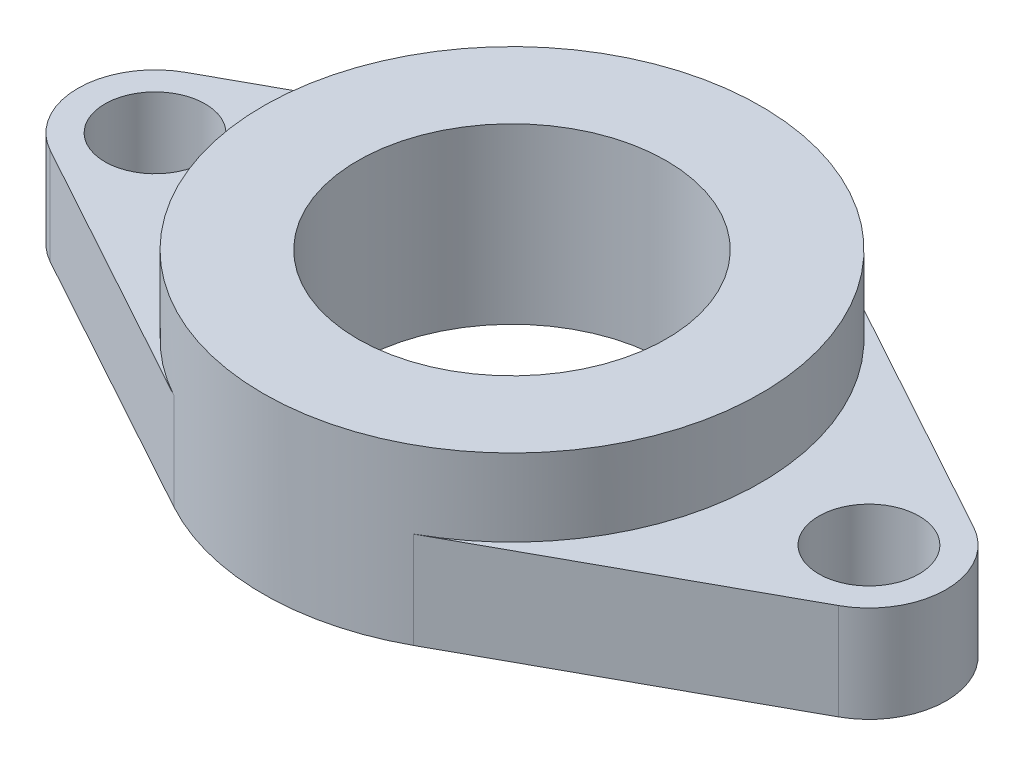
ISO-10303-21;
HEADER;
FILE_DESCRIPTION(('STEP AP214'),'2;1');
FILE_NAME('part.step','',(''),(''),'','','');
FILE_SCHEMA(('AUTOMOTIVE_DESIGN { 1 0 10303 214 1 1 1 1 }'));
ENDSEC;
DATA;
#1=APPLICATION_CONTEXT('core data for automotive mechanical design processes');
#2=APPLICATION_PROTOCOL_DEFINITION('international standard','automotive_design',2000,#1);
#3=PRODUCT_CONTEXT('',#1,'mechanical');
#4=PRODUCT('Part','Part','',(#3));
#5=PRODUCT_RELATED_PRODUCT_CATEGORY('part','',(#4));
#6=PRODUCT_DEFINITION_FORMATION('','',#4);
#7=PRODUCT_DEFINITION_CONTEXT('part definition',#1,'design');
#8=PRODUCT_DEFINITION('design','',#6,#7);
#9=PRODUCT_DEFINITION_SHAPE('','',#8);
#10=(LENGTH_UNIT() NAMED_UNIT(*) SI_UNIT(.MILLI.,.METRE.));
#11=(NAMED_UNIT(*) PLANE_ANGLE_UNIT() SI_UNIT($,.RADIAN.));
#12=(NAMED_UNIT(*) SI_UNIT($,.STERADIAN.) SOLID_ANGLE_UNIT());
#13=UNCERTAINTY_MEASURE_WITH_UNIT(LENGTH_MEASURE(1.E-05),#10,'distance_accuracy_value','');
#14=(GEOMETRIC_REPRESENTATION_CONTEXT(3) GLOBAL_UNCERTAINTY_ASSIGNED_CONTEXT((#13)) GLOBAL_UNIT_ASSIGNED_CONTEXT((#10,
#11,#12)) REPRESENTATION_CONTEXT('',''));
#15=CARTESIAN_POINT('',(0.,0.,0.));
#16=DIRECTION('',(0.,0.,1.));
#17=DIRECTION('',(1.,0.,0.));
#18=AXIS2_PLACEMENT_3D('',#15,#16,#17);
#19=CARTESIAN_POINT('',(0.,9.,0.));
#20=DIRECTION('',(0.,-1.,0.));
#21=DIRECTION('',(0.,0.,-1.));
#22=AXIS2_PLACEMENT_3D('',#19,#20,#21);
#23=CYLINDRICAL_SURFACE('',#22,12.9);
#24=CARTESIAN_POINT('',(0.,5.,0.));
#25=DIRECTION('',(0.,1.,0.));
#26=DIRECTION('',(0.,0.,1.));
#27=AXIS2_PLACEMENT_3D('',#24,#25,#26);
#28=CIRCLE('',#27,12.9);
#29=CARTESIAN_POINT('',(-6.20594594594594,5.,-11.3091217570595));
#30=VERTEX_POINT('',#29);
#31=CARTESIAN_POINT('',(-6.20594594594594,5.,11.3091217570595));
#32=VERTEX_POINT('',#31);
#33=EDGE_CURVE('E44',#30,#32,#28,.T.);
#34=ORIENTED_EDGE('',*,*,#33,.T.);
#35=DIRECTION('',(0.,-1.,0.));
#36=VECTOR('',#35,1.);
#37=CARTESIAN_POINT('',(-6.20594594594594,5.,11.3091217570595));
#38=LINE('',#37,#36);
#39=CARTESIAN_POINT('',(-6.20594594594594,0.,11.3091217570595));
#40=VERTEX_POINT('',#39);
#41=EDGE_CURVE('E108',#32,#40,#38,.T.);
#42=ORIENTED_EDGE('',*,*,#41,.T.);
#43=CARTESIAN_POINT('',(0.,0.,0.));
#44=DIRECTION('',(0.,1.,0.));
#45=DIRECTION('',(0.,0.,1.));
#46=AXIS2_PLACEMENT_3D('',#43,#44,#45);
#47=CIRCLE('',#46,12.9);
#48=CARTESIAN_POINT('',(6.20594594594594,0.,11.3091217570595));
#49=VERTEX_POINT('',#48);
#50=EDGE_CURVE('E125',#40,#49,#47,.T.);
#51=ORIENTED_EDGE('',*,*,#50,.T.);
#52=DIRECTION('',(0.,-1.,0.));
#53=VECTOR('',#52,1.);
#54=CARTESIAN_POINT('',(6.20594594594594,5.,11.3091217570595));
#55=LINE('',#54,#53);
#56=CARTESIAN_POINT('',(6.20594594594594,5.,11.3091217570595));
#57=VERTEX_POINT('',#56);
#58=EDGE_CURVE('E129',#57,#49,#55,.T.);
#59=ORIENTED_EDGE('',*,*,#58,.F.);
#60=CARTESIAN_POINT('',(6.20594594594595,5.,-11.3091217570595));
#61=VERTEX_POINT('',#60);
#62=EDGE_CURVE('E11',#57,#61,#28,.T.);
#63=ORIENTED_EDGE('',*,*,#62,.T.);
#64=DIRECTION('',(0.,-1.,0.));
#65=VECTOR('',#64,1.);
#66=CARTESIAN_POINT('',(6.20594594594594,5.,-11.3091217570595));
#67=LINE('',#66,#65);
#68=CARTESIAN_POINT('',(6.20594594594594,0.,-11.3091217570595));
#69=VERTEX_POINT('',#68);
#70=EDGE_CURVE('E139',#61,#69,#67,.T.);
#71=ORIENTED_EDGE('',*,*,#70,.T.);
#72=CARTESIAN_POINT('',(-6.20594594594595,0.,-11.3091217570595));
#73=VERTEX_POINT('',#72);
#74=EDGE_CURVE('E127',#69,#73,#47,.T.);
#75=ORIENTED_EDGE('',*,*,#74,.T.);
#76=DIRECTION('',(0.,-1.,0.));
#77=VECTOR('',#76,1.);
#78=CARTESIAN_POINT('',(-6.20594594594594,5.,-11.3091217570595));
#79=LINE('',#78,#77);
#80=EDGE_CURVE('E56',#30,#73,#79,.T.);
#81=ORIENTED_EDGE('',*,*,#80,.F.);
#82=EDGE_LOOP('',(#34,#42,#51,#59,#63,#71,#75,#81));
#83=FACE_BOUND('',#82,.T.);
#84=CARTESIAN_POINT('',(0.,9.,0.));
#85=DIRECTION('',(0.,1.,0.));
#86=DIRECTION('',(0.,0.,1.));
#87=AXIS2_PLACEMENT_3D('',#84,#85,#86);
#88=CIRCLE('',#87,12.9);
#89=CARTESIAN_POINT('',(0.,9.,12.9));
#90=VERTEX_POINT('',#89);
#91=EDGE_CURVE('E133',#90,#90,#88,.T.);
#92=ORIENTED_EDGE('',*,*,#91,.F.);
#93=EDGE_LOOP('',(#92));
#94=FACE_BOUND('',#93,.T.);
#95=ADVANCED_FACE('F36',(#83,#94),#23,.T.);
#96=CARTESIAN_POINT('',(0.,9.,0.));
#97=DIRECTION('',(0.,1.,0.));
#98=DIRECTION('',(0.,0.,1.));
#99=AXIS2_PLACEMENT_3D('',#96,#97,#98);
#100=PLANE('',#99);
#101=CARTESIAN_POINT('',(0.,9.,0.));
#102=DIRECTION('',(0.,1.,0.));
#103=DIRECTION('',(0.,0.,1.));
#104=AXIS2_PLACEMENT_3D('',#101,#102,#103);
#105=CIRCLE('',#104,8.);
#106=CARTESIAN_POINT('',(0.,9.,8.));
#107=VERTEX_POINT('',#106);
#108=EDGE_CURVE('E186',#107,#107,#105,.F.);
#109=ORIENTED_EDGE('',*,*,#108,.T.);
#110=EDGE_LOOP('',(#109));
#111=FACE_BOUND('',#110,.T.);
#112=ORIENTED_EDGE('',*,*,#91,.T.);
#113=EDGE_LOOP('',(#112));
#114=FACE_BOUND('',#113,.T.);
#115=ADVANCED_FACE('F204',(#111,#114),#100,.T.);
#116=CARTESIAN_POINT('',(0.,0.,0.));
#117=DIRECTION('',(0.,1.,0.));
#118=DIRECTION('',(0.,0.,1.));
#119=AXIS2_PLACEMENT_3D('',#116,#117,#118);
#120=PLANE('',#119);
#121=CARTESIAN_POINT('',(0.,0.,0.));
#122=DIRECTION('',(0.,1.,0.));
#123=DIRECTION('',(0.,0.,1.));
#124=AXIS2_PLACEMENT_3D('',#121,#122,#123);
#125=CIRCLE('',#124,8.);
#126=CARTESIAN_POINT('',(0.,0.,8.));
#127=VERTEX_POINT('',#126);
#128=EDGE_CURVE('E39',#127,#127,#125,.F.);
#129=ORIENTED_EDGE('',*,*,#128,.F.);
#130=EDGE_LOOP('',(#129));
#131=FACE_BOUND('',#130,.T.);
#132=CARTESIAN_POINT('',(18.5,0.,0.));
#133=DIRECTION('',(0.,1.,0.));
#134=DIRECTION('',(0.,0.,1.));
#135=AXIS2_PLACEMENT_3D('',#132,#133,#134);
#136=CIRCLE('',#135,2.6);
#137=CARTESIAN_POINT('',(18.5,0.,2.6));
#138=VERTEX_POINT('',#137);
#139=EDGE_CURVE('E175',#138,#138,#136,.T.);
#140=ORIENTED_EDGE('',*,*,#139,.T.);
#141=EDGE_LOOP('',(#140));
#142=FACE_BOUND('',#141,.T.);
#143=CARTESIAN_POINT('',(-18.5,0.,0.));
#144=DIRECTION('',(0.,1.,0.));
#145=DIRECTION('',(0.,0.,1.));
#146=AXIS2_PLACEMENT_3D('',#143,#144,#145);
#147=CIRCLE('',#146,2.6);
#148=CARTESIAN_POINT('',(-18.5,0.,2.6));
#149=VERTEX_POINT('',#148);
#150=EDGE_CURVE('E185',#149,#149,#147,.T.);
#151=ORIENTED_EDGE('',*,*,#150,.T.);
#152=EDGE_LOOP('',(#151));
#153=FACE_BOUND('',#152,.T.);
#154=ORIENTED_EDGE('',*,*,#74,.F.);
#155=DIRECTION('',(-0.876676105198413,0.,-0.481081081081081));
#156=VECTOR('',#155,1.);
#157=CARTESIAN_POINT('',(6.20594594594594,0.,-11.3091217570595));
#158=LINE('',#157,#156);
#159=CARTESIAN_POINT('',(20.4243243243243,0.,-3.50670442079365));
#160=VERTEX_POINT('',#159);
#161=EDGE_CURVE('E149',#160,#69,#158,.T.);
#162=ORIENTED_EDGE('',*,*,#161,.F.);
#163=CARTESIAN_POINT('',(18.5,0.,0.));
#164=DIRECTION('',(0.,1.,0.));
#165=DIRECTION('',(0.,0.,1.));
#166=AXIS2_PLACEMENT_3D('',#163,#164,#165);
#167=CIRCLE('',#166,4.);
#168=CARTESIAN_POINT('',(20.4243243243243,0.,3.50670442079365));
#169=VERTEX_POINT('',#168);
#170=EDGE_CURVE('E151',#169,#160,#167,.T.);
#171=ORIENTED_EDGE('',*,*,#170,.F.);
#172=DIRECTION('',(0.876676105198413,0.,-0.481081081081081));
#173=VECTOR('',#172,1.);
#174=CARTESIAN_POINT('',(6.20594594594594,0.,11.3091217570595));
#175=LINE('',#174,#173);
#176=EDGE_CURVE('E168',#49,#169,#175,.T.);
#177=ORIENTED_EDGE('',*,*,#176,.F.);
#178=ORIENTED_EDGE('',*,*,#50,.F.);
#179=DIRECTION('',(0.876676105198413,0.,0.481081081081081));
#180=VECTOR('',#179,1.);
#181=CARTESIAN_POINT('',(-20.4243243243243,0.,3.50670442079365));
#182=LINE('',#181,#180);
#183=CARTESIAN_POINT('',(-20.4243243243243,0.,3.50670442079365));
#184=VERTEX_POINT('',#183);
#185=EDGE_CURVE('E170',#184,#40,#182,.T.);
#186=ORIENTED_EDGE('',*,*,#185,.F.);
#187=CARTESIAN_POINT('',(-18.5,0.,0.));
#188=DIRECTION('',(0.,1.,0.));
#189=DIRECTION('',(0.,0.,1.));
#190=AXIS2_PLACEMENT_3D('',#187,#188,#189);
#191=CIRCLE('',#190,4.);
#192=CARTESIAN_POINT('',(-20.4243243243243,0.,-3.50670442079365));
#193=VERTEX_POINT('',#192);
#194=EDGE_CURVE('E124',#193,#184,#191,.T.);
#195=ORIENTED_EDGE('',*,*,#194,.F.);
#196=DIRECTION('',(-0.876676105198413,0.,0.481081081081081));
#197=VECTOR('',#196,1.);
#198=CARTESIAN_POINT('',(-20.4243243243243,0.,-3.50670442079365));
#199=LINE('',#198,#197);
#200=EDGE_CURVE('E120',#73,#193,#199,.T.);
#201=ORIENTED_EDGE('',*,*,#200,.F.);
#202=EDGE_LOOP('',(#154,#162,#171,#177,#178,#186,#195,#201));
#203=FACE_BOUND('',#202,.T.);
#204=ADVANCED_FACE('F148',(#131,#142,#153,#203),#120,.F.);
#205=CARTESIAN_POINT('',(-18.5,5.,0.));
#206=DIRECTION('',(0.,-1.,0.));
#207=DIRECTION('',(0.,0.,-1.));
#208=AXIS2_PLACEMENT_3D('',#205,#206,#207);
#209=CYLINDRICAL_SURFACE('',#208,4.);
#210=ORIENTED_EDGE('',*,*,#194,.T.);
#211=DIRECTION('',(0.,-1.,0.));
#212=VECTOR('',#211,1.);
#213=CARTESIAN_POINT('',(-20.4243243243243,5.,3.50670442079365));
#214=LINE('',#213,#212);
#215=CARTESIAN_POINT('',(-20.4243243243243,5.,3.50670442079365));
#216=VERTEX_POINT('',#215);
#217=EDGE_CURVE('E105',#216,#184,#214,.T.);
#218=ORIENTED_EDGE('',*,*,#217,.F.);
#219=CARTESIAN_POINT('',(-18.5,5.,0.));
#220=DIRECTION('',(0.,1.,0.));
#221=DIRECTION('',(0.,0.,1.));
#222=AXIS2_PLACEMENT_3D('',#219,#220,#221);
#223=CIRCLE('',#222,4.);
#224=CARTESIAN_POINT('',(-20.4243243243243,5.,-3.50670442079365));
#225=VERTEX_POINT('',#224);
#226=EDGE_CURVE('E111',#225,#216,#223,.T.);
#227=ORIENTED_EDGE('',*,*,#226,.F.);
#228=DIRECTION('',(0.,-1.,0.));
#229=VECTOR('',#228,1.);
#230=CARTESIAN_POINT('',(-20.4243243243243,5.,-3.50670442079365));
#231=LINE('',#230,#229);
#232=EDGE_CURVE('E146',#225,#193,#231,.T.);
#233=ORIENTED_EDGE('',*,*,#232,.T.);
#234=EDGE_LOOP('',(#210,#218,#227,#233));
#235=FACE_BOUND('',#234,.T.);
#236=ADVANCED_FACE('F122',(#235),#209,.T.);
#237=CARTESIAN_POINT('',(-18.5,5.,0.));
#238=DIRECTION('',(0.,1.,0.));
#239=DIRECTION('',(0.,0.,1.));
#240=AXIS2_PLACEMENT_3D('',#237,#238,#239);
#241=PLANE('',#240);
#242=CARTESIAN_POINT('',(-18.5,5.,0.));
#243=DIRECTION('',(0.,1.,0.));
#244=DIRECTION('',(0.,0.,1.));
#245=AXIS2_PLACEMENT_3D('',#242,#243,#244);
#246=CIRCLE('',#245,2.6);
#247=CARTESIAN_POINT('',(-18.5,5.,2.6));
#248=VERTEX_POINT('',#247);
#249=EDGE_CURVE('E182',#248,#248,#246,.T.);
#250=ORIENTED_EDGE('',*,*,#249,.F.);
#251=EDGE_LOOP('',(#250));
#252=FACE_BOUND('',#251,.T.);
#253=ORIENTED_EDGE('',*,*,#33,.F.);
#254=DIRECTION('',(-0.876676105198413,0.,0.481081081081081));
#255=VECTOR('',#254,1.);
#256=CARTESIAN_POINT('',(-20.4243243243243,5.,-3.50670442079365));
#257=LINE('',#256,#255);
#258=EDGE_CURVE('E116',#30,#225,#257,.T.);
#259=ORIENTED_EDGE('',*,*,#258,.T.);
#260=ORIENTED_EDGE('',*,*,#226,.T.);
#261=DIRECTION('',(0.876676105198413,0.,0.481081081081081));
#262=VECTOR('',#261,1.);
#263=CARTESIAN_POINT('',(-20.4243243243243,5.,3.50670442079365));
#264=LINE('',#263,#262);
#265=EDGE_CURVE('E100',#216,#32,#264,.T.);
#266=ORIENTED_EDGE('',*,*,#265,.T.);
#267=EDGE_LOOP('',(#253,#259,#260,#266));
#268=FACE_BOUND('',#267,.T.);
#269=ADVANCED_FACE('F114',(#252,#268),#241,.T.);
#270=CARTESIAN_POINT('',(-20.4243243243243,5.,-3.50670442079365));
#271=DIRECTION('',(0.481081081081081,0.,0.876676105198413));
#272=DIRECTION('',(0.876676105198413,0.,-0.481081081081081));
#273=AXIS2_PLACEMENT_3D('',#270,#271,#272);
#274=PLANE('',#273);
#275=ORIENTED_EDGE('',*,*,#200,.T.);
#276=ORIENTED_EDGE('',*,*,#232,.F.);
#277=ORIENTED_EDGE('',*,*,#258,.F.);
#278=ORIENTED_EDGE('',*,*,#80,.T.);
#279=EDGE_LOOP('',(#275,#276,#277,#278));
#280=FACE_BOUND('',#279,.T.);
#281=ADVANCED_FACE('F145',(#280),#274,.F.);
#282=CARTESIAN_POINT('',(-20.4243243243243,5.,3.50670442079365));
#283=DIRECTION('',(0.481081081081081,0.,-0.876676105198413));
#284=DIRECTION('',(-0.876676105198413,0.,-0.481081081081081));
#285=AXIS2_PLACEMENT_3D('',#282,#283,#284);
#286=PLANE('',#285);
#287=ORIENTED_EDGE('',*,*,#185,.T.);
#288=ORIENTED_EDGE('',*,*,#41,.F.);
#289=ORIENTED_EDGE('',*,*,#265,.F.);
#290=ORIENTED_EDGE('',*,*,#217,.T.);
#291=EDGE_LOOP('',(#287,#288,#289,#290));
#292=FACE_BOUND('',#291,.T.);
#293=ADVANCED_FACE('F103',(#292),#286,.F.);
#294=CARTESIAN_POINT('',(18.5,5.,0.));
#295=DIRECTION('',(0.,1.,0.));
#296=DIRECTION('',(0.,0.,1.));
#297=AXIS2_PLACEMENT_3D('',#294,#295,#296);
#298=CIRCLE('',#297,2.6);
#299=CARTESIAN_POINT('',(18.5,5.,2.6));
#300=VERTEX_POINT('',#299);
#301=EDGE_CURVE('E189',#300,#300,#298,.T.);
#302=ORIENTED_EDGE('',*,*,#301,.F.);
#303=EDGE_LOOP('',(#302));
#304=FACE_BOUND('',#303,.T.);
#305=ORIENTED_EDGE('',*,*,#62,.F.);
#306=DIRECTION('',(0.876676105198413,0.,-0.481081081081081));
#307=VECTOR('',#306,1.);
#308=CARTESIAN_POINT('',(6.20594594594594,5.,11.3091217570595));
#309=LINE('',#308,#307);
#310=CARTESIAN_POINT('',(20.4243243243243,5.,3.50670442079365));
#311=VERTEX_POINT('',#310);
#312=EDGE_CURVE('E110',#57,#311,#309,.T.);
#313=ORIENTED_EDGE('',*,*,#312,.T.);
#314=CARTESIAN_POINT('',(18.5,5.,0.));
#315=DIRECTION('',(0.,1.,0.));
#316=DIRECTION('',(0.,0.,1.));
#317=AXIS2_PLACEMENT_3D('',#314,#315,#316);
#318=CIRCLE('',#317,4.);
#319=CARTESIAN_POINT('',(20.4243243243243,5.,-3.50670442079365));
#320=VERTEX_POINT('',#319);
#321=EDGE_CURVE('E179',#311,#320,#318,.T.);
#322=ORIENTED_EDGE('',*,*,#321,.T.);
#323=DIRECTION('',(-0.876676105198413,0.,-0.481081081081081));
#324=VECTOR('',#323,1.);
#325=CARTESIAN_POINT('',(6.20594594594594,5.,-11.3091217570595));
#326=LINE('',#325,#324);
#327=EDGE_CURVE('E177',#320,#61,#326,.T.);
#328=ORIENTED_EDGE('',*,*,#327,.T.);
#329=EDGE_LOOP('',(#305,#313,#322,#328));
#330=FACE_BOUND('',#329,.T.);
#331=ADVANCED_FACE('F218',(#304,#330),#241,.T.);
#332=CARTESIAN_POINT('',(6.20594594594594,5.,11.3091217570595));
#333=DIRECTION('',(-0.481081081081081,0.,-0.876676105198413));
#334=DIRECTION('',(-0.876676105198413,0.,0.481081081081081));
#335=AXIS2_PLACEMENT_3D('',#332,#333,#334);
#336=PLANE('',#335);
#337=ORIENTED_EDGE('',*,*,#176,.T.);
#338=DIRECTION('',(0.,-1.,0.));
#339=VECTOR('',#338,1.);
#340=CARTESIAN_POINT('',(20.4243243243243,5.,3.50670442079365));
#341=LINE('',#340,#339);
#342=EDGE_CURVE('E160',#311,#169,#341,.T.);
#343=ORIENTED_EDGE('',*,*,#342,.F.);
#344=ORIENTED_EDGE('',*,*,#312,.F.);
#345=ORIENTED_EDGE('',*,*,#58,.T.);
#346=EDGE_LOOP('',(#337,#343,#344,#345));
#347=FACE_BOUND('',#346,.T.);
#348=ADVANCED_FACE('F166',(#347),#336,.F.);
#349=CARTESIAN_POINT('',(18.5,5.,0.));
#350=DIRECTION('',(0.,-1.,0.));
#351=DIRECTION('',(0.,0.,-1.));
#352=AXIS2_PLACEMENT_3D('',#349,#350,#351);
#353=CYLINDRICAL_SURFACE('',#352,4.);
#354=ORIENTED_EDGE('',*,*,#170,.T.);
#355=DIRECTION('',(0.,-1.,0.));
#356=VECTOR('',#355,1.);
#357=CARTESIAN_POINT('',(20.4243243243243,5.,-3.50670442079365));
#358=LINE('',#357,#356);
#359=EDGE_CURVE('E157',#320,#160,#358,.T.);
#360=ORIENTED_EDGE('',*,*,#359,.F.);
#361=ORIENTED_EDGE('',*,*,#321,.F.);
#362=ORIENTED_EDGE('',*,*,#342,.T.);
#363=EDGE_LOOP('',(#354,#360,#361,#362));
#364=FACE_BOUND('',#363,.T.);
#365=ADVANCED_FACE('F239',(#364),#353,.T.);
#366=CARTESIAN_POINT('',(6.20594594594594,5.,-11.3091217570595));
#367=DIRECTION('',(-0.481081081081081,0.,0.876676105198413));
#368=DIRECTION('',(0.876676105198413,0.,0.481081081081081));
#369=AXIS2_PLACEMENT_3D('',#366,#367,#368);
#370=PLANE('',#369);
#371=ORIENTED_EDGE('',*,*,#161,.T.);
#372=ORIENTED_EDGE('',*,*,#70,.F.);
#373=ORIENTED_EDGE('',*,*,#327,.F.);
#374=ORIENTED_EDGE('',*,*,#359,.T.);
#375=EDGE_LOOP('',(#371,#372,#373,#374));
#376=FACE_BOUND('',#375,.T.);
#377=ADVANCED_FACE('F242',(#376),#370,.F.);
#378=CARTESIAN_POINT('',(18.5,0.,0.));
#379=DIRECTION('',(0.,1.,0.));
#380=DIRECTION('',(0.,0.,1.));
#381=AXIS2_PLACEMENT_3D('',#378,#379,#380);
#382=CYLINDRICAL_SURFACE('',#381,2.6);
#383=ORIENTED_EDGE('',*,*,#139,.F.);
#384=EDGE_LOOP('',(#383));
#385=FACE_BOUND('',#384,.T.);
#386=ORIENTED_EDGE('',*,*,#301,.T.);
#387=EDGE_LOOP('',(#386));
#388=FACE_BOUND('',#387,.T.);
#389=ADVANCED_FACE('F212',(#385,#388),#382,.F.);
#390=CARTESIAN_POINT('',(-18.5,0.,0.));
#391=DIRECTION('',(0.,1.,0.));
#392=DIRECTION('',(0.,0.,1.));
#393=AXIS2_PLACEMENT_3D('',#390,#391,#392);
#394=CYLINDRICAL_SURFACE('',#393,2.6);
#395=ORIENTED_EDGE('',*,*,#150,.F.);
#396=EDGE_LOOP('',(#395));
#397=FACE_BOUND('',#396,.T.);
#398=ORIENTED_EDGE('',*,*,#249,.T.);
#399=EDGE_LOOP('',(#398));
#400=FACE_BOUND('',#399,.T.);
#401=ADVANCED_FACE('F209',(#397,#400),#394,.F.);
#402=CARTESIAN_POINT('',(0.,26.,0.));
#403=DIRECTION('',(0.,-1.,0.));
#404=DIRECTION('',(0.,0.,-1.));
#405=AXIS2_PLACEMENT_3D('',#402,#403,#404);
#406=CYLINDRICAL_SURFACE('',#405,8.);
#407=ORIENTED_EDGE('',*,*,#108,.F.);
#408=EDGE_LOOP('',(#407));
#409=FACE_BOUND('',#408,.T.);
#410=ORIENTED_EDGE('',*,*,#128,.T.);
#411=EDGE_LOOP('',(#410));
#412=FACE_BOUND('',#411,.T.);
#413=ADVANCED_FACE('F200',(#409,#412),#406,.F.);
#414=CLOSED_SHELL('',(#95,#115,#204,#236,#269,#281,#293,#331,#348,#365,#377,#389,#401,#413));
#415=MANIFOLD_SOLID_BREP('B2',#414);
#416=ADVANCED_BREP_SHAPE_REPRESENTATION('',(#18,#415),#14);
#417=SHAPE_DEFINITION_REPRESENTATION(#9,#416);
ENDSEC;
END-ISO-10303-21;
